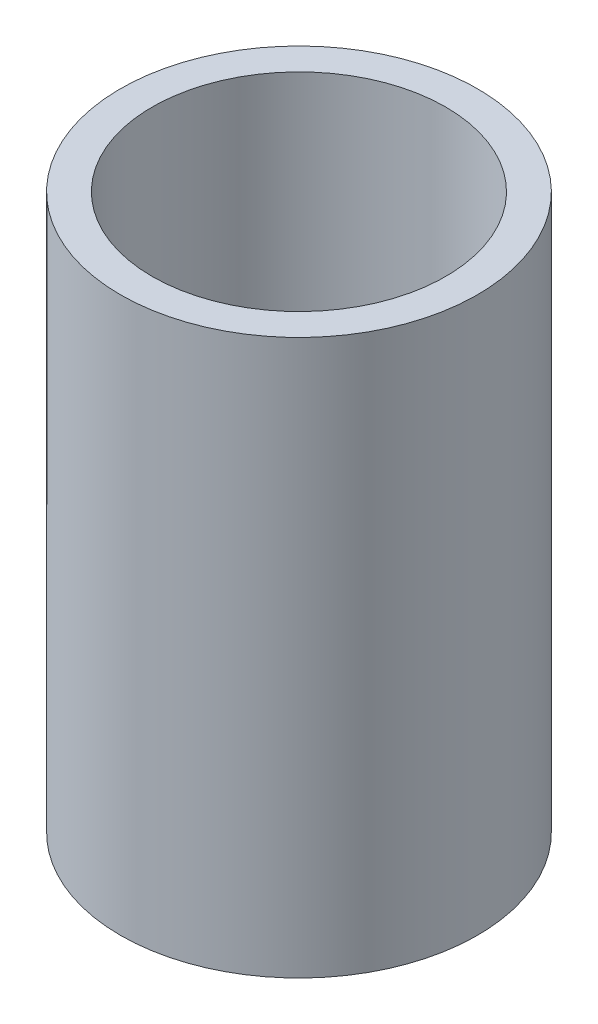
ISO-10303-21;
HEADER;
FILE_DESCRIPTION(('STEP AP214'),'2;1');
FILE_NAME('part.step','',(''),(''),'','','');
FILE_SCHEMA(('AUTOMOTIVE_DESIGN { 1 0 10303 214 1 1 1 1 }'));
ENDSEC;
DATA;
#1=APPLICATION_CONTEXT('core data for automotive mechanical design processes');
#2=APPLICATION_PROTOCOL_DEFINITION('international standard','automotive_design',2000,#1);
#3=PRODUCT_CONTEXT('',#1,'mechanical');
#4=PRODUCT('Part','Part','',(#3));
#5=PRODUCT_RELATED_PRODUCT_CATEGORY('part','',(#4));
#6=PRODUCT_DEFINITION_FORMATION('','',#4);
#7=PRODUCT_DEFINITION_CONTEXT('part definition',#1,'design');
#8=PRODUCT_DEFINITION('design','',#6,#7);
#9=PRODUCT_DEFINITION_SHAPE('','',#8);
#10=(LENGTH_UNIT() NAMED_UNIT(*) SI_UNIT(.MILLI.,.METRE.));
#11=(NAMED_UNIT(*) PLANE_ANGLE_UNIT() SI_UNIT($,.RADIAN.));
#12=(NAMED_UNIT(*) SI_UNIT($,.STERADIAN.) SOLID_ANGLE_UNIT());
#13=UNCERTAINTY_MEASURE_WITH_UNIT(LENGTH_MEASURE(1.E-05),#10,'distance_accuracy_value','');
#14=(GEOMETRIC_REPRESENTATION_CONTEXT(3) GLOBAL_UNCERTAINTY_ASSIGNED_CONTEXT((#13)) GLOBAL_UNIT_ASSIGNED_CONTEXT((#10,
#11,#12)) REPRESENTATION_CONTEXT('',''));
#15=CARTESIAN_POINT('',(0.,0.,0.));
#16=DIRECTION('',(0.,0.,1.));
#17=DIRECTION('',(1.,0.,0.));
#18=AXIS2_PLACEMENT_3D('',#15,#16,#17);
#19=CARTESIAN_POINT('',(0.,30.,0.));
#20=DIRECTION('',(0.,1.,0.));
#21=DIRECTION('',(0.,0.,1.));
#22=AXIS2_PLACEMENT_3D('',#19,#20,#21);
#23=PLANE('',#22);
#24=CARTESIAN_POINT('',(0.,30.,0.));
#25=DIRECTION('',(0.,1.,0.));
#26=DIRECTION('',(0.,0.,1.));
#27=AXIS2_PLACEMENT_3D('',#24,#25,#26);
#28=CIRCLE('',#27,9.652);
#29=CARTESIAN_POINT('',(0.,30.,9.652));
#30=VERTEX_POINT('',#29);
#31=EDGE_CURVE('E10',#30,#30,#28,.T.);
#32=ORIENTED_EDGE('',*,*,#31,.T.);
#33=EDGE_LOOP('',(#32));
#34=FACE_BOUND('',#33,.T.);
#35=CARTESIAN_POINT('',(0.,30.,0.));
#36=DIRECTION('',(0.,1.,0.));
#37=DIRECTION('',(0.,0.,1.));
#38=AXIS2_PLACEMENT_3D('',#35,#36,#37);
#39=CIRCLE('',#38,7.9375);
#40=CARTESIAN_POINT('',(0.,30.,7.9375));
#41=VERTEX_POINT('',#40);
#42=EDGE_CURVE('E41',#41,#41,#39,.T.);
#43=ORIENTED_EDGE('',*,*,#42,.F.);
#44=EDGE_LOOP('',(#43));
#45=FACE_BOUND('',#44,.T.);
#46=ADVANCED_FACE('F30',(#34,#45),#23,.T.);
#47=CARTESIAN_POINT('',(0.,0.,0.));
#48=DIRECTION('',(0.,1.,0.));
#49=DIRECTION('',(0.,0.,1.));
#50=AXIS2_PLACEMENT_3D('',#47,#48,#49);
#51=PLANE('',#50);
#52=CARTESIAN_POINT('',(0.,0.,0.));
#53=DIRECTION('',(0.,1.,0.));
#54=DIRECTION('',(0.,0.,1.));
#55=AXIS2_PLACEMENT_3D('',#52,#53,#54);
#56=CIRCLE('',#55,9.652);
#57=CARTESIAN_POINT('',(0.,0.,9.652));
#58=VERTEX_POINT('',#57);
#59=EDGE_CURVE('E34',#58,#58,#56,.T.);
#60=ORIENTED_EDGE('',*,*,#59,.F.);
#61=EDGE_LOOP('',(#60));
#62=FACE_BOUND('',#61,.T.);
#63=CARTESIAN_POINT('',(0.,0.,0.));
#64=DIRECTION('',(0.,1.,0.));
#65=DIRECTION('',(0.,0.,1.));
#66=AXIS2_PLACEMENT_3D('',#63,#64,#65);
#67=CIRCLE('',#66,7.9375);
#68=CARTESIAN_POINT('',(0.,0.,7.9375));
#69=VERTEX_POINT('',#68);
#70=EDGE_CURVE('E43',#69,#69,#67,.T.);
#71=ORIENTED_EDGE('',*,*,#70,.T.);
#72=EDGE_LOOP('',(#71));
#73=FACE_BOUND('',#72,.T.);
#74=ADVANCED_FACE('F53',(#62,#73),#51,.F.);
#75=CARTESIAN_POINT('',(0.,30.,0.));
#76=DIRECTION('',(0.,-1.,0.));
#77=DIRECTION('',(0.,0.,-1.));
#78=AXIS2_PLACEMENT_3D('',#75,#76,#77);
#79=CYLINDRICAL_SURFACE('',#78,9.652);
#80=ORIENTED_EDGE('',*,*,#31,.F.);
#81=EDGE_LOOP('',(#80));
#82=FACE_BOUND('',#81,.T.);
#83=ORIENTED_EDGE('',*,*,#59,.T.);
#84=EDGE_LOOP('',(#83));
#85=FACE_BOUND('',#84,.T.);
#86=ADVANCED_FACE('F32',(#82,#85),#79,.T.);
#87=CARTESIAN_POINT('',(0.,30.,0.));
#88=DIRECTION('',(0.,-1.,0.));
#89=DIRECTION('',(0.,0.,-1.));
#90=AXIS2_PLACEMENT_3D('',#87,#88,#89);
#91=CYLINDRICAL_SURFACE('',#90,7.9375);
#92=ORIENTED_EDGE('',*,*,#42,.T.);
#93=EDGE_LOOP('',(#92));
#94=FACE_BOUND('',#93,.T.);
#95=ORIENTED_EDGE('',*,*,#70,.F.);
#96=EDGE_LOOP('',(#95));
#97=FACE_BOUND('',#96,.T.);
#98=ADVANCED_FACE('F49',(#94,#97),#91,.F.);
#99=CLOSED_SHELL('',(#46,#74,#86,#98));
#100=MANIFOLD_SOLID_BREP('B2',#99);
#101=ADVANCED_BREP_SHAPE_REPRESENTATION('',(#18,#100),#14);
#102=SHAPE_DEFINITION_REPRESENTATION(#9,#101);
ENDSEC;
END-ISO-10303-21;
